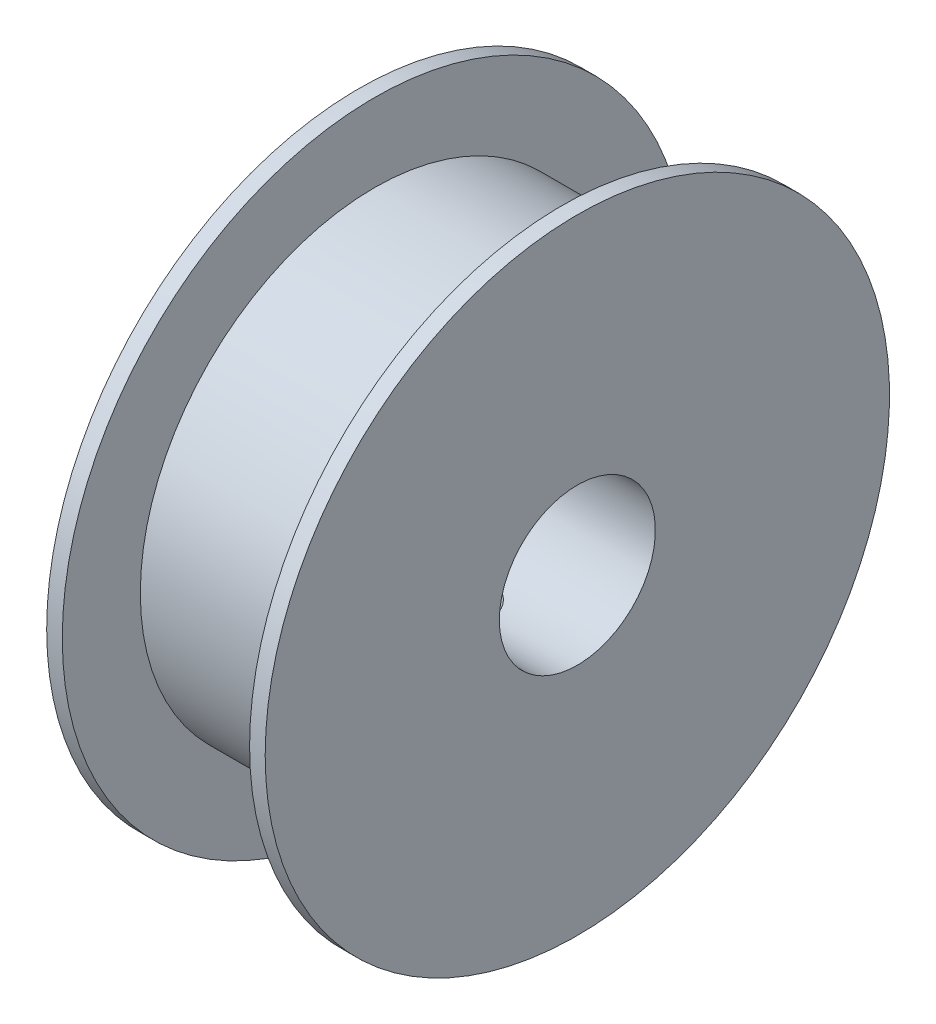
ISO-10303-21;
HEADER;
FILE_DESCRIPTION(('STEP AP214'),'2;1');
FILE_NAME('part.step','',(''),(''),'','','');
FILE_SCHEMA(('AUTOMOTIVE_DESIGN { 1 0 10303 214 1 1 1 1 }'));
ENDSEC;
DATA;
#1=APPLICATION_CONTEXT('core data for automotive mechanical design processes');
#2=APPLICATION_PROTOCOL_DEFINITION('international standard','automotive_design',2000,#1);
#3=PRODUCT_CONTEXT('',#1,'mechanical');
#4=PRODUCT('Part','Part','',(#3));
#5=PRODUCT_RELATED_PRODUCT_CATEGORY('part','',(#4));
#6=PRODUCT_DEFINITION_FORMATION('','',#4);
#7=PRODUCT_DEFINITION_CONTEXT('part definition',#1,'design');
#8=PRODUCT_DEFINITION('design','',#6,#7);
#9=PRODUCT_DEFINITION_SHAPE('','',#8);
#10=(LENGTH_UNIT() NAMED_UNIT(*) SI_UNIT(.MILLI.,.METRE.));
#11=(NAMED_UNIT(*) PLANE_ANGLE_UNIT() SI_UNIT($,.RADIAN.));
#12=(NAMED_UNIT(*) SI_UNIT($,.STERADIAN.) SOLID_ANGLE_UNIT());
#13=UNCERTAINTY_MEASURE_WITH_UNIT(LENGTH_MEASURE(1.E-05),#10,'distance_accuracy_value','');
#14=(GEOMETRIC_REPRESENTATION_CONTEXT(3) GLOBAL_UNCERTAINTY_ASSIGNED_CONTEXT((#13)) GLOBAL_UNIT_ASSIGNED_CONTEXT((#10,
#11,#12)) REPRESENTATION_CONTEXT('',''));
#15=CARTESIAN_POINT('',(0.,0.,0.));
#16=DIRECTION('',(0.,0.,1.));
#17=DIRECTION('',(1.,0.,0.));
#18=AXIS2_PLACEMENT_3D('',#15,#16,#17);
#19=CARTESIAN_POINT('',(-49.8494068842632,0.,20.0560361776407));
#20=DIRECTION('',(-1.,0.,0.));
#21=DIRECTION('',(0.,0.,1.));
#22=AXIS2_PLACEMENT_3D('',#19,#20,#21);
#23=CYLINDRICAL_SURFACE('',#22,20.);
#24=CARTESIAN_POINT('',(-44.7308545798672,0.,20.0560361776407));
#25=DIRECTION('',(-1.,0.,0.));
#26=DIRECTION('',(0.,0.,1.));
#27=AXIS2_PLACEMENT_3D('',#24,#25,#26);
#28=CIRCLE('',#27,20.);
#29=CARTESIAN_POINT('',(-44.7308545798672,0.,40.0560361776407));
#30=VERTEX_POINT('',#29);
#31=EDGE_CURVE('E63',#30,#30,#28,.T.);
#32=ORIENTED_EDGE('',*,*,#31,.F.);
#33=EDGE_LOOP('',(#32));
#34=FACE_BOUND('',#33,.T.);
#35=CARTESIAN_POINT('',(-43.7308545798672,0.,20.0560361776407));
#36=DIRECTION('',(-1.,0.,0.));
#37=DIRECTION('',(0.,0.,1.));
#38=AXIS2_PLACEMENT_3D('',#35,#36,#37);
#39=CIRCLE('',#38,20.);
#40=CARTESIAN_POINT('',(-43.7308545798672,0.,40.0560361776407));
#41=VERTEX_POINT('',#40);
#42=EDGE_CURVE('E10',#41,#41,#39,.T.);
#43=ORIENTED_EDGE('',*,*,#42,.T.);
#44=EDGE_LOOP('',(#43));
#45=FACE_BOUND('',#44,.T.);
#46=ADVANCED_FACE('F31',(#34,#45),#23,.T.);
#47=CARTESIAN_POINT('',(-43.7308545798672,0.,0.0560361776407448));
#48=DIRECTION('',(-1.,0.,0.));
#49=DIRECTION('',(0.,0.,1.));
#50=AXIS2_PLACEMENT_3D('',#47,#48,#49);
#51=PLANE('',#50);
#52=ORIENTED_EDGE('',*,*,#42,.F.);
#53=EDGE_LOOP('',(#52));
#54=FACE_BOUND('',#53,.T.);
#55=CARTESIAN_POINT('',(-43.7308545798672,0.,20.0560361776407));
#56=DIRECTION('',(-1.,0.,0.));
#57=DIRECTION('',(0.,0.,1.));
#58=AXIS2_PLACEMENT_3D('',#55,#56,#57);
#59=CIRCLE('',#58,15.);
#60=CARTESIAN_POINT('',(-43.7308545798672,0.,35.0560361776407));
#61=VERTEX_POINT('',#60);
#62=EDGE_CURVE('E42',#61,#61,#59,.T.);
#63=ORIENTED_EDGE('',*,*,#62,.T.);
#64=EDGE_LOOP('',(#63));
#65=FACE_BOUND('',#64,.T.);
#66=ADVANCED_FACE('F101',(#54,#65),#51,.F.);
#67=CARTESIAN_POINT('',(-49.8494068842632,0.,20.0560361776407));
#68=DIRECTION('',(-1.,0.,0.));
#69=DIRECTION('',(0.,0.,1.));
#70=AXIS2_PLACEMENT_3D('',#67,#68,#69);
#71=CYLINDRICAL_SURFACE('',#70,15.);
#72=CARTESIAN_POINT('',(-37.7308545798672,-14.9144225500017,21.6560361776407));
#73=CARTESIAN_POINT('',(-37.6412565888924,-14.9144236655933,21.6560323127364));
#74=CARTESIAN_POINT('',(-37.5516001486898,-14.9152386417625,21.6484847560006));
#75=CARTESIAN_POINT('',(-37.3747753240401,-14.9184098476283,21.6184913808744));
#76=CARTESIAN_POINT('',(-37.2876097544806,-14.9207677542496,21.5960293523893));
#77=CARTESIAN_POINT('',(-37.1183528283659,-14.9267547699762,21.5368705670349));
#78=CARTESIAN_POINT('',(-37.0362583425626,-14.9303830857339,21.5001826924183));
#79=CARTESIAN_POINT('',(-36.8794093412271,-14.9385011292845,21.4136312202387));
#80=CARTESIAN_POINT('',(-36.8046534216364,-14.9429906918111,21.3637701498155));
#81=CARTESIAN_POINT('',(-36.6642787395788,-14.9523460689031,21.2520673578389));
#82=CARTESIAN_POINT('',(-36.5986944731294,-14.9572132022761,21.1901823919092));
#83=CARTESIAN_POINT('',(-36.4788220851314,-14.9667633778283,21.0562811269401));
#84=CARTESIAN_POINT('',(-36.4245344912235,-14.9714464114003,20.9842643549312));
#85=CARTESIAN_POINT('',(-36.3286759368629,-14.9801139039791,20.8319308435279));
#86=CARTESIAN_POINT('',(-36.2871357055182,-14.9840966651839,20.7515946624799));
#87=CARTESIAN_POINT('',(-36.2181476904811,-14.9909004707378,20.585037492711));
#88=CARTESIAN_POINT('',(-36.1906995194533,-14.9937215470167,20.4988166658096));
#89=CARTESIAN_POINT('',(-36.1507764975354,-14.9978748574594,20.3232875577804));
#90=CARTESIAN_POINT('',(-36.1382447767579,-14.9992127450233,20.2339923472546));
#91=CARTESIAN_POINT('',(-36.1283343494322,-15.0002681826757,20.0545568302117));
#92=CARTESIAN_POINT('',(-36.1309552000684,-14.9999857801152,19.9644165484678));
#93=CARTESIAN_POINT('',(-36.1512295000159,-14.9978370703299,19.7862359121619));
#94=CARTESIAN_POINT('',(-36.168821795094,-14.9959772067036,19.6981885105843));
#95=CARTESIAN_POINT('',(-36.2184442527998,-14.9908899262437,19.5263031148105));
#96=CARTESIAN_POINT('',(-36.250474624907,-14.9876624895682,19.4424651817084));
#97=CARTESIAN_POINT('',(-36.3281305677545,-14.9801917630767,19.2811866509887));
#98=CARTESIAN_POINT('',(-36.3737830534523,-14.9759464654356,19.203759109756));
#99=CARTESIAN_POINT('',(-36.4773677663219,-14.9669160371749,19.0576417042459));
#100=CARTESIAN_POINT('',(-36.5353004035534,-14.962130888531,18.9889521318701));
#101=CARTESIAN_POINT('',(-36.662144514172,-14.9525292725756,18.8619020477762));
#102=CARTESIAN_POINT('',(-36.7311092110492,-14.9477127679481,18.803594663104));
#103=CARTESIAN_POINT('',(-36.877875674098,-14.9386149965148,18.699375784939));
#104=CARTESIAN_POINT('',(-36.9556774561651,-14.9343337306718,18.6534643137436));
#105=CARTESIAN_POINT('',(-37.1179520033578,-14.9267909175718,18.5753399745346));
#106=CARTESIAN_POINT('',(-37.2024264760579,-14.9235296323989,18.5431306265151));
#107=CARTESIAN_POINT('',(-37.3756272299974,-14.9184013871239,18.4933681173521));
#108=CARTESIAN_POINT('',(-37.4643533633038,-14.9165343785466,18.4758144466671));
#109=CARTESIAN_POINT('',(-37.6430717421569,-14.9144146003332,18.4559304092112));
#110=CARTESIAN_POINT('',(-37.7330556165361,-14.914153938196,18.4535256098236));
#111=CARTESIAN_POINT('',(-37.9121450214029,-14.9152555286042,18.4638118773613));
#112=CARTESIAN_POINT('',(-38.0012505654055,-14.9166177561386,18.4765027116408));
#113=CARTESIAN_POINT('',(-38.1758354801393,-14.9208044527218,18.5165576276903));
#114=CARTESIAN_POINT('',(-38.2613230649851,-14.9236253932699,18.5438863074639));
#115=CARTESIAN_POINT('',(-38.4265011121702,-14.9304088072498,18.6124049388579));
#116=CARTESIAN_POINT('',(-38.5061914240119,-14.9343713103036,18.6535952501712));
#117=CARTESIAN_POINT('',(-38.6578514629253,-14.9430104351993,18.7488535148471));
#118=CARTESIAN_POINT('',(-38.7297901321486,-14.9476897601603,18.8029706661976));
#119=CARTESIAN_POINT('',(-38.8635893871637,-14.9572265334338,18.9224761470013));
#120=CARTESIAN_POINT('',(-38.9254496886995,-14.9620839867655,18.9878647942552));
#121=CARTESIAN_POINT('',(-39.037594077137,-14.9714536371823,19.1283805843653));
#122=CARTESIAN_POINT('',(-39.0878295202163,-14.9759643325541,19.2035466635937));
#123=CARTESIAN_POINT('',(-39.1749630080714,-14.9841102341174,19.3612920433897));
#124=CARTESIAN_POINT('',(-39.2118612572873,-14.9877454537285,19.4438712303009));
#125=CARTESIAN_POINT('',(-39.2711910403719,-14.9937240629098,19.6139309143894));
#126=CARTESIAN_POINT('',(-39.2936516420748,-14.9960700467537,19.7014011755621));
#127=CARTESIAN_POINT('',(-39.3235633531027,-14.9992165342767,19.8788978045657));
#128=CARTESIAN_POINT('',(-39.3310149465423,-15.0000170878034,19.9689240898571));
#129=CARTESIAN_POINT('',(-39.3306897683637,-14.9999824379928,20.1485001655406));
#130=CARTESIAN_POINT('',(-39.3229883842556,-14.9991553324116,20.2380501035077));
#131=CARTESIAN_POINT('',(-39.2927343370414,-14.9959742980278,20.4145760913493));
#132=CARTESIAN_POINT('',(-39.2701816669227,-14.9936203685045,20.5015521400084));
#133=CARTESIAN_POINT('',(-39.2108868324186,-14.9876492980642,20.6704585051961));
#134=CARTESIAN_POINT('',(-39.1741472288251,-14.9840323851315,20.7523897292405));
#135=CARTESIAN_POINT('',(-39.0875293559588,-14.9759378682743,20.9089348387753));
#136=CARTESIAN_POINT('',(-39.0376511055162,-14.9714602655833,20.9835487347525));
#137=CARTESIAN_POINT('',(-38.9258898303516,-14.9621189097809,21.1237273565908));
#138=CARTESIAN_POINT('',(-38.8639506378233,-14.9572534154219,21.1892471864386));
#139=CARTESIAN_POINT('',(-38.7299386060694,-14.9476992164899,21.3089953406162));
#140=CARTESIAN_POINT('',(-38.6578633473456,-14.9430105544671,21.3632209613069));
#141=CARTESIAN_POINT('',(-38.5053963885181,-14.9343265816053,21.458966837947));
#142=CARTESIAN_POINT('',(-38.4249815241576,-14.9303332892578,21.5004503644136));
#143=CARTESIAN_POINT('',(-38.258334463341,-14.9235160982773,21.569269161836));
#144=CARTESIAN_POINT('',(-38.1721088938709,-14.9206908928619,21.5966202518801));
#145=CARTESIAN_POINT('',(-38.0263131951117,-14.9172357939645,21.6296435128485));
#146=CARTESIAN_POINT('',(-37.9676723529666,-14.916185880525,21.6395270656153));
#147=CARTESIAN_POINT('',(-37.8496477639283,-14.9147788904034,21.6527246630897));
#148=CARTESIAN_POINT('',(-37.7902640207155,-14.9144218102902,21.65603874033));
#149=CARTESIAN_POINT('',(-37.7308545798672,-14.9144225500017,21.6560361776407));
#150=B_SPLINE_CURVE_WITH_KNOTS('',3,(#72,#73,#74,#75,#76,#77,#78,#79,#80,#81,#82,#83,#84,#85,
#86,#87,#88,#89,#90,#91,#92,#93,#94,#95,#96,#97,#98,#99,#100,#101,#102,#103,#104,#105,#106,#107,
#108,#109,#110,#111,#112,#113,#114,#115,#116,#117,#118,#119,#120,#121,#122,#123,#124,#125,#126,
#127,#128,#129,#130,#131,#132,#133,#134,#135,#136,#137,#138,#139,#140,#141,#142,#143,#144,#145,
#146,#147,#148,#149),.UNSPECIFIED.,.T.,.F.,(4,2,2,2,2,2,2,2,2,2,2,2,2,2,2,2,2,2,2,2,2,2,2,2,2,2,
2,2,2,2,2,2,2,2,2,2,2,2,4),(0.,0.268577001529124,0.537446390261954,0.806148173479042,
1.07479844645294,1.34443343913401,1.61408102300266,1.88437361023824,2.15465876779301,
2.42391011167973,2.69315358705864,2.96130252668383,3.22945535696219,3.49814155961667,
3.76683673567383,4.03686964273638,4.30690303552161,4.57700575645424,4.84709908619821,
5.11586429481954,5.3846253614294,5.65273933841567,5.92086027317743,6.19001837516274,
6.4591840673222,6.72945648996832,6.99972476955153,7.26944718972389,7.53916090987708,
7.80753617116474,8.07591155917663,8.34423852710792,8.61256511047858,8.8821725404879,
9.15184443588199,9.42228652782287,9.69242524206732,9.87051058001084,10.0485950360567),.UNSPECIFIED.);
#151=CARTESIAN_POINT('',(-37.7308545798672,-14.9144225500017,21.6560361776407));
#152=VERTEX_POINT('',#151);
#153=EDGE_CURVE('E66',#152,#152,#150,.T.);
#154=ORIENTED_EDGE('',*,*,#153,.T.);
#155=EDGE_LOOP('',(#154));
#156=FACE_BOUND('',#155,.T.);
#157=ORIENTED_EDGE('',*,*,#62,.F.);
#158=EDGE_LOOP('',(#157));
#159=FACE_BOUND('',#158,.T.);
#160=CARTESIAN_POINT('',(-31.7308545798672,0.,20.0560361776407));
#161=DIRECTION('',(-1.,0.,0.));
#162=DIRECTION('',(0.,0.,1.));
#163=AXIS2_PLACEMENT_3D('',#160,#161,#162);
#164=CIRCLE('',#163,15.);
#165=CARTESIAN_POINT('',(-31.7308545798672,0.,35.0560361776407));
#166=VERTEX_POINT('',#165);
#167=EDGE_CURVE('E46',#166,#166,#164,.T.);
#168=ORIENTED_EDGE('',*,*,#167,.T.);
#169=EDGE_LOOP('',(#168));
#170=FACE_BOUND('',#169,.T.);
#171=ADVANCED_FACE('F71',(#156,#159,#170),#71,.T.);
#172=CARTESIAN_POINT('',(-31.7308545798672,0.,5.05603617764075));
#173=DIRECTION('',(1.,0.,0.));
#174=DIRECTION('',(0.,0.,-1.));
#175=AXIS2_PLACEMENT_3D('',#172,#173,#174);
#176=PLANE('',#175);
#177=ORIENTED_EDGE('',*,*,#167,.F.);
#178=EDGE_LOOP('',(#177));
#179=FACE_BOUND('',#178,.T.);
#180=CARTESIAN_POINT('',(-31.7308545798672,0.,20.0560361776407));
#181=DIRECTION('',(-1.,0.,0.));
#182=DIRECTION('',(0.,0.,1.));
#183=AXIS2_PLACEMENT_3D('',#180,#181,#182);
#184=CIRCLE('',#183,20.);
#185=CARTESIAN_POINT('',(-31.7308545798672,0.,40.0560361776407));
#186=VERTEX_POINT('',#185);
#187=EDGE_CURVE('E51',#186,#186,#184,.T.);
#188=ORIENTED_EDGE('',*,*,#187,.T.);
#189=EDGE_LOOP('',(#188));
#190=FACE_BOUND('',#189,.T.);
#191=ADVANCED_FACE('F94',(#179,#190),#176,.F.);
#192=CARTESIAN_POINT('',(-49.8494068842632,0.,20.0560361776407));
#193=DIRECTION('',(-1.,0.,0.));
#194=DIRECTION('',(0.,0.,1.));
#195=AXIS2_PLACEMENT_3D('',#192,#193,#194);
#196=CYLINDRICAL_SURFACE('',#195,20.);
#197=ORIENTED_EDGE('',*,*,#187,.F.);
#198=EDGE_LOOP('',(#197));
#199=FACE_BOUND('',#198,.T.);
#200=CARTESIAN_POINT('',(-30.7308545798672,0.,20.0560361776407));
#201=DIRECTION('',(-1.,0.,0.));
#202=DIRECTION('',(0.,0.,1.));
#203=AXIS2_PLACEMENT_3D('',#200,#201,#202);
#204=CIRCLE('',#203,20.);
#205=CARTESIAN_POINT('',(-30.7308545798672,0.,40.0560361776407));
#206=VERTEX_POINT('',#205);
#207=EDGE_CURVE('E54',#206,#206,#204,.T.);
#208=ORIENTED_EDGE('',*,*,#207,.T.);
#209=EDGE_LOOP('',(#208));
#210=FACE_BOUND('',#209,.T.);
#211=ADVANCED_FACE('F91',(#199,#210),#196,.T.);
#212=CARTESIAN_POINT('',(-30.7308545798672,0.,0.0560361776407448));
#213=DIRECTION('',(-1.,0.,0.));
#214=DIRECTION('',(0.,0.,1.));
#215=AXIS2_PLACEMENT_3D('',#212,#213,#214);
#216=PLANE('',#215);
#217=ORIENTED_EDGE('',*,*,#207,.F.);
#218=EDGE_LOOP('',(#217));
#219=FACE_BOUND('',#218,.T.);
#220=CARTESIAN_POINT('',(-30.7308545798672,0.,20.0560361776407));
#221=DIRECTION('',(-1.,0.,0.));
#222=DIRECTION('',(0.,0.,1.));
#223=AXIS2_PLACEMENT_3D('',#220,#221,#222);
#224=CIRCLE('',#223,5.);
#225=CARTESIAN_POINT('',(-30.7308545798672,0.,25.0560361776407));
#226=VERTEX_POINT('',#225);
#227=EDGE_CURVE('E57',#226,#226,#224,.T.);
#228=ORIENTED_EDGE('',*,*,#227,.T.);
#229=EDGE_LOOP('',(#228));
#230=FACE_BOUND('',#229,.T.);
#231=ADVANCED_FACE('F87',(#219,#230),#216,.F.);
#232=CARTESIAN_POINT('',(-49.8494068842632,0.,20.0560361776407));
#233=DIRECTION('',(-1.,0.,0.));
#234=DIRECTION('',(0.,0.,1.));
#235=AXIS2_PLACEMENT_3D('',#232,#233,#234);
#236=CYLINDRICAL_SURFACE('',#235,5.);
#237=CARTESIAN_POINT('',(-37.7308545798672,-4.73708771293081,21.6560361776407));
#238=CARTESIAN_POINT('',(-37.8182208178501,-4.73708798780949,21.6560359213795));
#239=CARTESIAN_POINT('',(-37.9055900836201,-4.73953109593308,21.6488561093054));
#240=CARTESIAN_POINT('',(-38.077754167489,-4.7489937190314,21.6204138693658));
#241=CARTESIAN_POINT('',(-38.1625483835371,-4.75601429573487,21.5991481743081));
#242=CARTESIAN_POINT('',(-38.3270426815075,-4.77375701461625,21.5433463964661));
#243=CARTESIAN_POINT('',(-38.4067518051692,-4.78447235673699,21.5088346793099));
#244=CARTESIAN_POINT('',(-38.5592722208894,-4.80838765550231,21.4276025221848));
#245=CARTESIAN_POINT('',(-38.6320821802359,-4.82158809072754,21.3808797299262));
#246=CARTESIAN_POINT('',(-38.7713609749989,-4.84951968764674,21.2747485971722));
#247=CARTESIAN_POINT('',(-38.837544745342,-4.86428678030524,21.2149755249339));
#248=CARTESIAN_POINT('',(-38.9591410057311,-4.89338280213669,21.0852202999709));
#249=CARTESIAN_POINT('',(-39.0145519144894,-4.90771166672489,21.0152366511281));
#250=CARTESIAN_POINT('',(-39.1142999651672,-4.93472953085556,20.8649856001035));
#251=CARTESIAN_POINT('',(-39.1583417291765,-4.94737131144711,20.7845128655017));
#252=CARTESIAN_POINT('',(-39.2321531438328,-4.96916970645467,20.6168283711493));
#253=CARTESIAN_POINT('',(-39.2619263216299,-4.97832718206453,20.5296182830474));
#254=CARTESIAN_POINT('',(-39.3053983590956,-4.99187078015161,20.3539208877598));
#255=CARTESIAN_POINT('',(-39.3195848375288,-4.99640130994181,20.2655655665149));
#256=CARTESIAN_POINT('',(-39.3330276853683,-5.00069148119392,20.0876203075612));
#257=CARTESIAN_POINT('',(-39.332287608669,-5.00045225829628,19.9980306688099));
#258=CARTESIAN_POINT('',(-39.3162150778948,-4.9953294799159,19.8235986859738));
#259=CARTESIAN_POINT('',(-39.3014115820266,-4.99061428137964,19.7387018613372));
#260=CARTESIAN_POINT('',(-39.2585027566261,-4.97727793973528,19.5726678839911));
#261=CARTESIAN_POINT('',(-39.2303965462113,-4.96865653796686,19.4915309806477));
#262=CARTESIAN_POINT('',(-39.1613513473494,-4.94825462002066,19.3341222280259));
#263=CARTESIAN_POINT('',(-39.1202553982736,-4.93643573330445,19.2579244057672));
#264=CARTESIAN_POINT('',(-39.0265243729687,-4.9108788342044,19.1133447402296));
#265=CARTESIAN_POINT('',(-38.9738862723966,-4.89714031917112,19.0449649526362));
#266=CARTESIAN_POINT('',(-38.855866938134,-4.86849469180912,18.9148106523972));
#267=CARTESIAN_POINT('',(-38.7900302168097,-4.85356274482591,18.8534540398393));
#268=CARTESIAN_POINT('',(-38.6488663188876,-4.8247258395209,18.7425241040602));
#269=CARTESIAN_POINT('',(-38.5735379103118,-4.81082101488724,18.6929523128708));
#270=CARTESIAN_POINT('',(-38.4142978395739,-4.78548357380621,18.6064809338154));
#271=CARTESIAN_POINT('',(-38.330292504492,-4.77408325840667,18.5697436732464));
#272=CARTESIAN_POINT('',(-38.156833773475,-4.75542251488665,18.5110715601126));
#273=CARTESIAN_POINT('',(-38.067382462676,-4.74816051319963,18.4891310805863));
#274=CARTESIAN_POINT('',(-37.8895906697767,-4.73895031775712,18.4614972457281));
#275=CARTESIAN_POINT('',(-37.8013609315426,-4.73679204354283,18.4551611000986));
#276=CARTESIAN_POINT('',(-37.6250903093285,-4.73744898777772,18.4571054985694));
#277=CARTESIAN_POINT('',(-37.5370493967737,-4.74026339139206,18.4653836479362));
#278=CARTESIAN_POINT('',(-37.3664775525235,-4.7503404414304,18.4957460441936));
#279=CARTESIAN_POINT('',(-37.2838604331686,-4.75746344492905,18.517397311927));
#280=CARTESIAN_POINT('',(-37.1234434201271,-4.77520515081817,18.5733790547401));
#281=CARTESIAN_POINT('',(-37.0456443394967,-4.78582444131636,18.6077116630569));
#282=CARTESIAN_POINT('',(-36.8945067327055,-4.80975442366493,18.6892465935904));
#283=CARTESIAN_POINT('',(-36.8213700210579,-4.8231358439457,18.7368017080841));
#284=CARTESIAN_POINT('',(-36.6838811576834,-4.85093919332853,18.8430241799879));
#285=CARTESIAN_POINT('',(-36.6195314058589,-4.86536140505509,18.9016945628062));
#286=CARTESIAN_POINT('',(-36.498535469233,-4.89438512522789,19.0315351995916));
#287=CARTESIAN_POINT('',(-36.4423497782835,-4.90896684906861,19.1031401861507));
#288=CARTESIAN_POINT('',(-36.3427695025905,-4.93603865529218,19.2551172927545));
#289=CARTESIAN_POINT('',(-36.2993743717457,-4.94852882696537,19.3354890382958));
#290=CARTESIAN_POINT('',(-36.2270185825995,-4.96994289161967,19.5022524167365));
#291=CARTESIAN_POINT('',(-36.1979564614534,-4.97889176140864,19.5885966520841));
#292=CARTESIAN_POINT('',(-36.1548704757565,-4.9923242466308,19.7652861948155));
#293=CARTESIAN_POINT('',(-36.1408416525403,-4.99680933438748,19.8556301726574));
#294=CARTESIAN_POINT('',(-36.1286388719675,-5.00070652519304,20.0335255424782));
#295=CARTESIAN_POINT('',(-36.1298012648373,-5.00033097908979,20.1210272821352));
#296=CARTESIAN_POINT('',(-36.1463316646454,-4.99506275597099,20.294531615551));
#297=CARTESIAN_POINT('',(-36.1616986676676,-4.99017039818283,20.3805343148175));
#298=CARTESIAN_POINT('',(-36.2057728506332,-4.97648934157747,20.547439219233));
#299=CARTESIAN_POINT('',(-36.2342949523129,-4.96775477499445,20.6283950462139));
#300=CARTESIAN_POINT('',(-36.3037011894395,-4.9472892397229,20.7844087147449));
#301=CARTESIAN_POINT('',(-36.3445874917018,-4.93555774588147,20.8594655195894));
#302=CARTESIAN_POINT('',(-36.4392156876527,-4.90980554197593,21.0044140342954));
#303=CARTESIAN_POINT('',(-36.4933578160718,-4.89571902538267,21.0740326303735));
#304=CARTESIAN_POINT('',(-36.6122638557074,-4.86702383992102,21.2034153854433));
#305=CARTESIAN_POINT('',(-36.6770310195605,-4.85241501223218,21.2631765155036));
#306=CARTESIAN_POINT('',(-36.8180812255042,-4.82371532498013,21.3732781428801));
#307=CARTESIAN_POINT('',(-36.8946895819419,-4.80966084431258,21.423212586624));
#308=CARTESIAN_POINT('',(-37.0556392855369,-4.78430967821654,21.5094500644606));
#309=CARTESIAN_POINT('',(-37.1399778708978,-4.77301201309667,21.5457579435097));
#310=CARTESIAN_POINT('',(-37.307837420982,-4.75525868307298,21.6014522415065));
#311=CARTESIAN_POINT('',(-37.3909897357838,-4.74851573857385,21.6218586882354));
#312=CARTESIAN_POINT('',(-37.5597123787196,-4.73943073150288,21.649148899387));
#313=CARTESIAN_POINT('',(-37.6452820269241,-4.73708744369556,21.6560364286408));
#314=CARTESIAN_POINT('',(-37.7308545798672,-4.73708771293081,21.6560361776407));
#315=B_SPLINE_CURVE_WITH_KNOTS('',3,(#237,#238,#239,#240,#241,#242,#243,#244,#245,#246,#247,
#248,#249,#250,#251,#252,#253,#254,#255,#256,#257,#258,#259,#260,#261,#262,#263,#264,#265,#266,
#267,#268,#269,#270,#271,#272,#273,#274,#275,#276,#277,#278,#279,#280,#281,#282,#283,#284,#285,
#286,#287,#288,#289,#290,#291,#292,#293,#294,#295,#296,#297,#298,#299,#300,#301,#302,#303,#304,
#305,#306,#307,#308,#309,#310,#311,#312,#313,#314),.UNSPECIFIED.,.T.,.F.,(4,2,2,2,2,2,2,2,2,2,2,
2,2,2,2,2,2,2,2,2,2,2,2,2,2,2,2,2,2,2,2,2,2,2,2,2,2,2,4),(0.,0.261782337086137,0.5236254153324,
0.784989132393396,1.04640323461351,1.31636217216966,1.5863607056134,1.86279377491072,
2.13915847552485,2.4066067441957,2.67399133630597,2.93170127402817,3.18942827924008,
3.45039690075846,3.71143398470615,3.98385068324256,4.25630277672777,4.53208561817766,
4.80776352492636,5.07187991332532,5.33595302699622,5.59189456344125,5.84787917362796,
6.11148653292209,6.37516574550518,6.6503867238864,6.92559594982594,7.19882796886113,
7.47196983578452,7.73322052820113,7.99445275803872,8.2521168587703,8.50982614110574,
8.77656491371796,9.04338549583877,9.31960601009999,9.59572822026812,9.85220743369916,
10.1086152110862),.UNSPECIFIED.);
#316=CARTESIAN_POINT('',(-37.7308545798672,-4.73708771293081,21.6560361776407));
#317=VERTEX_POINT('',#316);
#318=EDGE_CURVE('E34',#317,#317,#315,.T.);
#319=ORIENTED_EDGE('',*,*,#318,.T.);
#320=EDGE_LOOP('',(#319));
#321=FACE_BOUND('',#320,.T.);
#322=ORIENTED_EDGE('',*,*,#227,.F.);
#323=EDGE_LOOP('',(#322));
#324=FACE_BOUND('',#323,.T.);
#325=CARTESIAN_POINT('',(-44.7308545798672,0.,20.0560361776407));
#326=DIRECTION('',(-1.,0.,0.));
#327=DIRECTION('',(0.,0.,1.));
#328=AXIS2_PLACEMENT_3D('',#325,#326,#327);
#329=CIRCLE('',#328,5.);
#330=CARTESIAN_POINT('',(-44.7308545798672,0.,25.0560361776407));
#331=VERTEX_POINT('',#330);
#332=EDGE_CURVE('E60',#331,#331,#329,.T.);
#333=ORIENTED_EDGE('',*,*,#332,.T.);
#334=EDGE_LOOP('',(#333));
#335=FACE_BOUND('',#334,.T.);
#336=ADVANCED_FACE('F82',(#321,#324,#335),#236,.F.);
#337=CARTESIAN_POINT('',(-44.7308545798672,0.,0.0560361776407448));
#338=DIRECTION('',(1.,0.,0.));
#339=DIRECTION('',(0.,0.,-1.));
#340=AXIS2_PLACEMENT_3D('',#337,#338,#339);
#341=PLANE('',#340);
#342=ORIENTED_EDGE('',*,*,#332,.F.);
#343=EDGE_LOOP('',(#342));
#344=FACE_BOUND('',#343,.T.);
#345=ORIENTED_EDGE('',*,*,#31,.T.);
#346=EDGE_LOOP('',(#345));
#347=FACE_BOUND('',#346,.T.);
#348=ADVANCED_FACE('F78',(#344,#347),#341,.F.);
#349=CARTESIAN_POINT('',(-37.7308545798672,-20.,20.0560361776407));
#350=DIRECTION('',(0.,1.,0.));
#351=DIRECTION('',(0.,0.,1.));
#352=AXIS2_PLACEMENT_3D('',#349,#350,#351);
#353=CYLINDRICAL_SURFACE('',#352,1.6);
#354=ORIENTED_EDGE('',*,*,#318,.F.);
#355=EDGE_LOOP('',(#354));
#356=FACE_BOUND('',#355,.T.);
#357=ORIENTED_EDGE('',*,*,#153,.F.);
#358=EDGE_LOOP('',(#357));
#359=FACE_BOUND('',#358,.T.);
#360=ADVANCED_FACE('F74',(#356,#359),#353,.F.);
#361=CLOSED_SHELL('',(#46,#66,#171,#191,#211,#231,#336,#348,#360));
#362=MANIFOLD_SOLID_BREP('B2',#361);
#363=ADVANCED_BREP_SHAPE_REPRESENTATION('',(#18,#362),#14);
#364=SHAPE_DEFINITION_REPRESENTATION(#9,#363);
ENDSEC;
END-ISO-10303-21;
